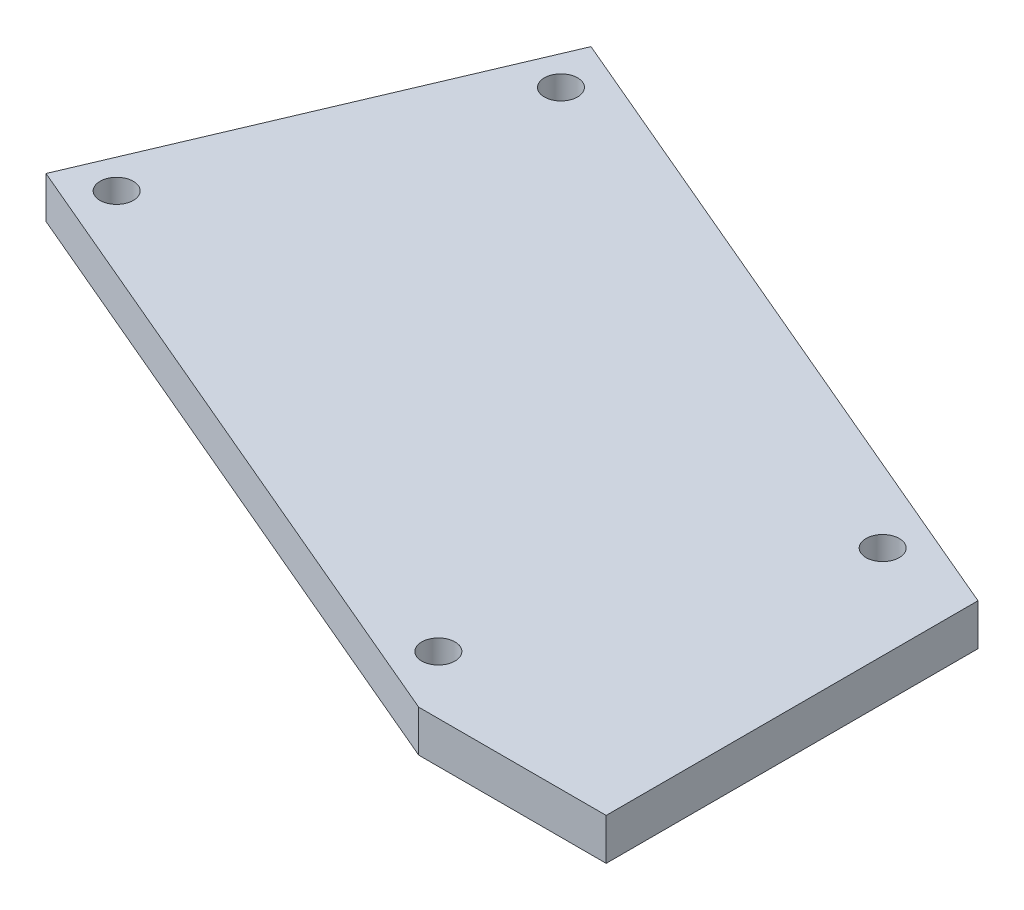
ISO-10303-21;
HEADER;
FILE_DESCRIPTION(('STEP AP214'),'2;1');
FILE_NAME('part.step','',(''),(''),'','','');
FILE_SCHEMA(('AUTOMOTIVE_DESIGN { 1 0 10303 214 1 1 1 1 }'));
ENDSEC;
DATA;
#1=APPLICATION_CONTEXT('core data for automotive mechanical design processes');
#2=APPLICATION_PROTOCOL_DEFINITION('international standard','automotive_design',2000,#1);
#3=PRODUCT_CONTEXT('',#1,'mechanical');
#4=PRODUCT('Part','Part','',(#3));
#5=PRODUCT_RELATED_PRODUCT_CATEGORY('part','',(#4));
#6=PRODUCT_DEFINITION_FORMATION('','',#4);
#7=PRODUCT_DEFINITION_CONTEXT('part definition',#1,'design');
#8=PRODUCT_DEFINITION('design','',#6,#7);
#9=PRODUCT_DEFINITION_SHAPE('','',#8);
#10=(LENGTH_UNIT() NAMED_UNIT(*) SI_UNIT(.MILLI.,.METRE.));
#11=(NAMED_UNIT(*) PLANE_ANGLE_UNIT() SI_UNIT($,.RADIAN.));
#12=(NAMED_UNIT(*) SI_UNIT($,.STERADIAN.) SOLID_ANGLE_UNIT());
#13=UNCERTAINTY_MEASURE_WITH_UNIT(LENGTH_MEASURE(1.E-05),#10,'distance_accuracy_value','');
#14=(GEOMETRIC_REPRESENTATION_CONTEXT(3) GLOBAL_UNCERTAINTY_ASSIGNED_CONTEXT((#13)) GLOBAL_UNIT_ASSIGNED_CONTEXT((#10,
#11,#12)) REPRESENTATION_CONTEXT('',''));
#15=CARTESIAN_POINT('',(0.,0.,0.));
#16=DIRECTION('',(0.,0.,1.));
#17=DIRECTION('',(1.,0.,0.));
#18=AXIS2_PLACEMENT_3D('',#15,#16,#17);
#19=CARTESIAN_POINT('',(0.,3.175,0.));
#20=DIRECTION('',(0.,-1.,0.));
#21=DIRECTION('',(0.,0.,-1.));
#22=AXIS2_PLACEMENT_3D('',#19,#20,#21);
#23=PLANE('',#22);
#24=CARTESIAN_POINT('',(-17.2577410529597,3.175,23.9745232491098));
#25=DIRECTION('',(0.,1.,0.));
#26=DIRECTION('',(0.,0.,1.));
#27=AXIS2_PLACEMENT_3D('',#24,#25,#26);
#28=CIRCLE('',#27,1.27);
#29=CARTESIAN_POINT('',(-17.2577410529597,3.175,25.2445232491098));
#30=VERTEX_POINT('',#29);
#31=EDGE_CURVE('E178',#30,#30,#28,.T.);
#32=ORIENTED_EDGE('',*,*,#31,.F.);
#33=EDGE_LOOP('',(#32));
#34=FACE_BOUND('',#33,.T.);
#35=CARTESIAN_POINT('',(-49.8993835743969,3.175,-18.0337554514725));
#36=DIRECTION('',(0.,1.,0.));
#37=DIRECTION('',(0.,0.,1.));
#38=AXIS2_PLACEMENT_3D('',#35,#36,#37);
#39=CIRCLE('',#38,1.27);
#40=CARTESIAN_POINT('',(-49.8993835743969,3.175,-16.7637554514725));
#41=VERTEX_POINT('',#40);
#42=EDGE_CURVE('E117',#41,#41,#39,.T.);
#43=ORIENTED_EDGE('',*,*,#42,.F.);
#44=EDGE_LOOP('',(#43));
#45=FACE_BOUND('',#44,.T.);
#46=DIRECTION('',(0.,0.,-1.));
#47=VECTOR('',#46,1.);
#48=CARTESIAN_POINT('',(0.,3.175,0.));
#49=LINE('',#48,#47);
#50=CARTESIAN_POINT('',(0.,3.175,28.4101902752035));
#51=VERTEX_POINT('',#50);
#52=CARTESIAN_POINT('',(0.,3.175,0.));
#53=VERTEX_POINT('',#52);
#54=EDGE_CURVE('E122',#51,#53,#49,.T.);
#55=ORIENTED_EDGE('',*,*,#54,.T.);
#56=DIRECTION('',(-0.920234570630628,0.,-0.391367263598098));
#57=VECTOR('',#56,1.);
#58=CARTESIAN_POINT('',(0.,3.175,0.));
#59=LINE('',#58,#57);
#60=CARTESIAN_POINT('',(-51.4509215930382,3.175,-21.8816017525493));
#61=VERTEX_POINT('',#60);
#62=EDGE_CURVE('E89',#53,#61,#59,.T.);
#63=ORIENTED_EDGE('',*,*,#62,.T.);
#64=DIRECTION('',(-0.391367263598097,0.,0.920234570630629));
#65=VECTOR('',#64,1.);
#66=CARTESIAN_POINT('',(-51.4509215930382,3.175,-21.8816017525493));
#67=LINE('',#66,#65);
#68=CARTESIAN_POINT('',(-63.8768322122778,3.175,7.33584586497312));
#69=VERTEX_POINT('',#68);
#70=EDGE_CURVE('E93',#61,#69,#67,.T.);
#71=ORIENTED_EDGE('',*,*,#70,.T.);
#72=DIRECTION('',(0.920234570630629,0.,0.391367263598097));
#73=VECTOR('',#72,1.);
#74=CARTESIAN_POINT('',(-63.8768322122778,3.175,7.33584586497312));
#75=LINE('',#74,#73);
#76=CARTESIAN_POINT('',(-14.3240410529597,3.175,28.4101902752035));
#77=VERTEX_POINT('',#76);
#78=EDGE_CURVE('E97',#69,#77,#75,.T.);
#79=ORIENTED_EDGE('',*,*,#78,.T.);
#80=DIRECTION('',(1.,0.,0.));
#81=VECTOR('',#80,1.);
#82=CARTESIAN_POINT('',(0.,3.175,28.4101902752035));
#83=LINE('',#82,#81);
#84=EDGE_CURVE('E55',#77,#51,#83,.T.);
#85=ORIENTED_EDGE('',*,*,#84,.T.);
#86=EDGE_LOOP('',(#55,#63,#71,#79,#85));
#87=FACE_BOUND('',#86,.T.);
#88=CARTESIAN_POINT('',(-60.028985911201,3.175,5.78430784633178));
#89=DIRECTION('',(0.,1.,0.));
#90=DIRECTION('',(0.,0.,1.));
#91=AXIS2_PLACEMENT_3D('',#88,#89,#90);
#92=CIRCLE('',#91,1.27);
#93=CARTESIAN_POINT('',(-60.028985911201,3.175,7.05430784633178));
#94=VERTEX_POINT('',#93);
#95=EDGE_CURVE('E184',#94,#94,#92,.T.);
#96=ORIENTED_EDGE('',*,*,#95,.F.);
#97=EDGE_LOOP('',(#96));
#98=FACE_BOUND('',#97,.T.);
#99=CARTESIAN_POINT('',(-7.12813871615561,3.175,0.156459951305494));
#100=DIRECTION('',(0.,1.,0.));
#101=DIRECTION('',(0.,0.,1.));
#102=AXIS2_PLACEMENT_3D('',#99,#100,#101);
#103=CIRCLE('',#102,1.27);
#104=CARTESIAN_POINT('',(-7.12813871615561,3.175,1.42645995130549));
#105=VERTEX_POINT('',#104);
#106=EDGE_CURVE('E169',#105,#105,#103,.T.);
#107=ORIENTED_EDGE('',*,*,#106,.F.);
#108=EDGE_LOOP('',(#107));
#109=FACE_BOUND('',#108,.T.);
#110=ADVANCED_FACE('F37',(#34,#45,#87,#98,#109),#23,.F.);
#111=CARTESIAN_POINT('',(0.,0.,0.));
#112=DIRECTION('',(0.,-1.,0.));
#113=DIRECTION('',(0.,0.,-1.));
#114=AXIS2_PLACEMENT_3D('',#111,#112,#113);
#115=PLANE('',#114);
#116=CARTESIAN_POINT('',(-17.2577410529597,0.,23.9745232491098));
#117=DIRECTION('',(0.,1.,0.));
#118=DIRECTION('',(0.,0.,1.));
#119=AXIS2_PLACEMENT_3D('',#116,#117,#118);
#120=CIRCLE('',#119,1.27);
#121=CARTESIAN_POINT('',(-17.2577410529597,0.,25.2445232491098));
#122=VERTEX_POINT('',#121);
#123=EDGE_CURVE('E175',#122,#122,#120,.T.);
#124=ORIENTED_EDGE('',*,*,#123,.T.);
#125=EDGE_LOOP('',(#124));
#126=FACE_BOUND('',#125,.T.);
#127=CARTESIAN_POINT('',(-49.8993835743969,0.,-18.0337554514725));
#128=DIRECTION('',(0.,1.,0.));
#129=DIRECTION('',(0.,0.,1.));
#130=AXIS2_PLACEMENT_3D('',#127,#128,#129);
#131=CIRCLE('',#130,1.27);
#132=CARTESIAN_POINT('',(-49.8993835743969,0.,-16.7637554514725));
#133=VERTEX_POINT('',#132);
#134=EDGE_CURVE('E187',#133,#133,#131,.T.);
#135=ORIENTED_EDGE('',*,*,#134,.T.);
#136=EDGE_LOOP('',(#135));
#137=FACE_BOUND('',#136,.T.);
#138=DIRECTION('',(0.,0.,-1.));
#139=VECTOR('',#138,1.);
#140=CARTESIAN_POINT('',(0.,0.,0.));
#141=LINE('',#140,#139);
#142=CARTESIAN_POINT('',(0.,0.,28.4101902752035));
#143=VERTEX_POINT('',#142);
#144=CARTESIAN_POINT('',(0.,0.,0.));
#145=VERTEX_POINT('',#144);
#146=EDGE_CURVE('E113',#143,#145,#141,.T.);
#147=ORIENTED_EDGE('',*,*,#146,.F.);
#148=DIRECTION('',(1.,0.,0.));
#149=VECTOR('',#148,1.);
#150=CARTESIAN_POINT('',(0.,0.,28.4101902752035));
#151=LINE('',#150,#149);
#152=CARTESIAN_POINT('',(-14.3240410529597,0.,28.4101902752035));
#153=VERTEX_POINT('',#152);
#154=EDGE_CURVE('E81',#153,#143,#151,.T.);
#155=ORIENTED_EDGE('',*,*,#154,.F.);
#156=DIRECTION('',(0.920234570630629,0.,0.391367263598097));
#157=VECTOR('',#156,1.);
#158=CARTESIAN_POINT('',(-63.8768322122778,0.,7.33584586497312));
#159=LINE('',#158,#157);
#160=CARTESIAN_POINT('',(-63.8768322122778,0.,7.33584586497312));
#161=VERTEX_POINT('',#160);
#162=EDGE_CURVE('E75',#161,#153,#159,.T.);
#163=ORIENTED_EDGE('',*,*,#162,.F.);
#164=DIRECTION('',(-0.391367263598097,0.,0.920234570630629));
#165=VECTOR('',#164,1.);
#166=CARTESIAN_POINT('',(-51.4509215930382,0.,-21.8816017525493));
#167=LINE('',#166,#165);
#168=CARTESIAN_POINT('',(-51.4509215930382,0.,-21.8816017525493));
#169=VERTEX_POINT('',#168);
#170=EDGE_CURVE('E104',#169,#161,#167,.T.);
#171=ORIENTED_EDGE('',*,*,#170,.F.);
#172=DIRECTION('',(-0.920234570630628,0.,-0.391367263598098));
#173=VECTOR('',#172,1.);
#174=CARTESIAN_POINT('',(0.,0.,0.));
#175=LINE('',#174,#173);
#176=EDGE_CURVE('E116',#145,#169,#175,.T.);
#177=ORIENTED_EDGE('',*,*,#176,.F.);
#178=EDGE_LOOP('',(#147,#155,#163,#171,#177));
#179=FACE_BOUND('',#178,.T.);
#180=CARTESIAN_POINT('',(-60.028985911201,0.,5.78430784633178));
#181=DIRECTION('',(0.,1.,0.));
#182=DIRECTION('',(0.,0.,1.));
#183=AXIS2_PLACEMENT_3D('',#180,#181,#182);
#184=CIRCLE('',#183,1.27);
#185=CARTESIAN_POINT('',(-60.028985911201,0.,7.05430784633178));
#186=VERTEX_POINT('',#185);
#187=EDGE_CURVE('E181',#186,#186,#184,.T.);
#188=ORIENTED_EDGE('',*,*,#187,.T.);
#189=EDGE_LOOP('',(#188));
#190=FACE_BOUND('',#189,.T.);
#191=CARTESIAN_POINT('',(-7.12813871615561,0.,0.156459951305494));
#192=DIRECTION('',(0.,1.,0.));
#193=DIRECTION('',(0.,0.,1.));
#194=AXIS2_PLACEMENT_3D('',#191,#192,#193);
#195=CIRCLE('',#194,1.27);
#196=CARTESIAN_POINT('',(-7.12813871615561,0.,1.42645995130549));
#197=VERTEX_POINT('',#196);
#198=EDGE_CURVE('E172',#197,#197,#195,.T.);
#199=ORIENTED_EDGE('',*,*,#198,.T.);
#200=EDGE_LOOP('',(#199));
#201=FACE_BOUND('',#200,.T.);
#202=ADVANCED_FACE('F126',(#126,#137,#179,#190,#201),#115,.T.);
#203=CARTESIAN_POINT('',(0.,3.175,0.));
#204=DIRECTION('',(-1.,0.,0.));
#205=DIRECTION('',(0.,0.,1.));
#206=AXIS2_PLACEMENT_3D('',#203,#204,#205);
#207=PLANE('',#206);
#208=ORIENTED_EDGE('',*,*,#146,.T.);
#209=DIRECTION('',(0.,-1.,0.));
#210=VECTOR('',#209,1.);
#211=CARTESIAN_POINT('',(0.,3.175,0.));
#212=LINE('',#211,#210);
#213=EDGE_CURVE('E11',#53,#145,#212,.T.);
#214=ORIENTED_EDGE('',*,*,#213,.F.);
#215=ORIENTED_EDGE('',*,*,#54,.F.);
#216=DIRECTION('',(0.,-1.,0.));
#217=VECTOR('',#216,1.);
#218=CARTESIAN_POINT('',(0.,3.175,28.4101902752035));
#219=LINE('',#218,#217);
#220=EDGE_CURVE('E109',#51,#143,#219,.T.);
#221=ORIENTED_EDGE('',*,*,#220,.T.);
#222=EDGE_LOOP('',(#208,#214,#215,#221));
#223=FACE_BOUND('',#222,.T.);
#224=ADVANCED_FACE('F39',(#223),#207,.F.);
#225=CARTESIAN_POINT('',(0.,3.175,0.));
#226=DIRECTION('',(-0.391367263598098,0.,0.920234570630628));
#227=DIRECTION('',(0.920234570630628,0.,0.391367263598098));
#228=AXIS2_PLACEMENT_3D('',#225,#226,#227);
#229=PLANE('',#228);
#230=ORIENTED_EDGE('',*,*,#176,.T.);
#231=DIRECTION('',(0.,-1.,0.));
#232=VECTOR('',#231,1.);
#233=CARTESIAN_POINT('',(-51.4509215930382,3.175,-21.8816017525493));
#234=LINE('',#233,#232);
#235=EDGE_CURVE('E47',#61,#169,#234,.T.);
#236=ORIENTED_EDGE('',*,*,#235,.F.);
#237=ORIENTED_EDGE('',*,*,#62,.F.);
#238=ORIENTED_EDGE('',*,*,#213,.T.);
#239=EDGE_LOOP('',(#230,#236,#237,#238));
#240=FACE_BOUND('',#239,.T.);
#241=ADVANCED_FACE('F235',(#240),#229,.F.);
#242=CARTESIAN_POINT('',(-51.4509215930382,3.175,-21.8816017525493));
#243=DIRECTION('',(0.920234570630629,0.,0.391367263598097));
#244=DIRECTION('',(0.391367263598097,0.,-0.920234570630629));
#245=AXIS2_PLACEMENT_3D('',#242,#243,#244);
#246=PLANE('',#245);
#247=ORIENTED_EDGE('',*,*,#170,.T.);
#248=DIRECTION('',(0.,-1.,0.));
#249=VECTOR('',#248,1.);
#250=CARTESIAN_POINT('',(-63.8768322122778,3.175,7.33584586497312));
#251=LINE('',#250,#249);
#252=EDGE_CURVE('E101',#69,#161,#251,.T.);
#253=ORIENTED_EDGE('',*,*,#252,.F.);
#254=ORIENTED_EDGE('',*,*,#70,.F.);
#255=ORIENTED_EDGE('',*,*,#235,.T.);
#256=EDGE_LOOP('',(#247,#253,#254,#255));
#257=FACE_BOUND('',#256,.T.);
#258=ADVANCED_FACE('F102',(#257),#246,.F.);
#259=CARTESIAN_POINT('',(-63.8768322122778,3.175,7.33584586497312));
#260=DIRECTION('',(0.391367263598097,0.,-0.920234570630629));
#261=DIRECTION('',(-0.920234570630629,0.,-0.391367263598097));
#262=AXIS2_PLACEMENT_3D('',#259,#260,#261);
#263=PLANE('',#262);
#264=ORIENTED_EDGE('',*,*,#162,.T.);
#265=DIRECTION('',(0.,-1.,0.));
#266=VECTOR('',#265,1.);
#267=CARTESIAN_POINT('',(-14.3240410529597,3.175,28.4101902752035));
#268=LINE('',#267,#266);
#269=EDGE_CURVE('E105',#77,#153,#268,.T.);
#270=ORIENTED_EDGE('',*,*,#269,.F.);
#271=ORIENTED_EDGE('',*,*,#78,.F.);
#272=ORIENTED_EDGE('',*,*,#252,.T.);
#273=EDGE_LOOP('',(#264,#270,#271,#272));
#274=FACE_BOUND('',#273,.T.);
#275=ADVANCED_FACE('F107',(#274),#263,.F.);
#276=CARTESIAN_POINT('',(0.,3.175,28.4101902752035));
#277=DIRECTION('',(0.,0.,-1.));
#278=DIRECTION('',(-1.,0.,0.));
#279=AXIS2_PLACEMENT_3D('',#276,#277,#278);
#280=PLANE('',#279);
#281=ORIENTED_EDGE('',*,*,#154,.T.);
#282=ORIENTED_EDGE('',*,*,#220,.F.);
#283=ORIENTED_EDGE('',*,*,#84,.F.);
#284=ORIENTED_EDGE('',*,*,#269,.T.);
#285=EDGE_LOOP('',(#281,#282,#283,#284));
#286=FACE_BOUND('',#285,.T.);
#287=ADVANCED_FACE('F131',(#286),#280,.F.);
#288=CARTESIAN_POINT('',(-49.8993835743969,3.175,-18.0337554514725));
#289=DIRECTION('',(0.,-1.,0.));
#290=DIRECTION('',(0.,0.,-1.));
#291=AXIS2_PLACEMENT_3D('',#288,#289,#290);
#292=CYLINDRICAL_SURFACE('',#291,1.27);
#293=ORIENTED_EDGE('',*,*,#42,.T.);
#294=EDGE_LOOP('',(#293));
#295=FACE_BOUND('',#294,.T.);
#296=ORIENTED_EDGE('',*,*,#134,.F.);
#297=EDGE_LOOP('',(#296));
#298=FACE_BOUND('',#297,.T.);
#299=ADVANCED_FACE('F133',(#295,#298),#292,.F.);
#300=CARTESIAN_POINT('',(-60.028985911201,3.175,5.78430784633178));
#301=DIRECTION('',(0.,-1.,0.));
#302=DIRECTION('',(0.,0.,-1.));
#303=AXIS2_PLACEMENT_3D('',#300,#301,#302);
#304=CYLINDRICAL_SURFACE('',#303,1.27);
#305=ORIENTED_EDGE('',*,*,#95,.T.);
#306=EDGE_LOOP('',(#305));
#307=FACE_BOUND('',#306,.T.);
#308=ORIENTED_EDGE('',*,*,#187,.F.);
#309=EDGE_LOOP('',(#308));
#310=FACE_BOUND('',#309,.T.);
#311=ADVANCED_FACE('F139',(#307,#310),#304,.F.);
#312=CARTESIAN_POINT('',(-17.2577410529597,3.175,23.9745232491098));
#313=DIRECTION('',(0.,-1.,0.));
#314=DIRECTION('',(0.,0.,-1.));
#315=AXIS2_PLACEMENT_3D('',#312,#313,#314);
#316=CYLINDRICAL_SURFACE('',#315,1.27);
#317=ORIENTED_EDGE('',*,*,#31,.T.);
#318=EDGE_LOOP('',(#317));
#319=FACE_BOUND('',#318,.T.);
#320=ORIENTED_EDGE('',*,*,#123,.F.);
#321=EDGE_LOOP('',(#320));
#322=FACE_BOUND('',#321,.T.);
#323=ADVANCED_FACE('F156',(#319,#322),#316,.F.);
#324=CARTESIAN_POINT('',(-7.12813871615561,3.175,0.156459951305494));
#325=DIRECTION('',(0.,-1.,0.));
#326=DIRECTION('',(0.,0.,-1.));
#327=AXIS2_PLACEMENT_3D('',#324,#325,#326);
#328=CYLINDRICAL_SURFACE('',#327,1.27);
#329=ORIENTED_EDGE('',*,*,#106,.T.);
#330=EDGE_LOOP('',(#329));
#331=FACE_BOUND('',#330,.T.);
#332=ORIENTED_EDGE('',*,*,#198,.F.);
#333=EDGE_LOOP('',(#332));
#334=FACE_BOUND('',#333,.T.);
#335=ADVANCED_FACE('F160',(#331,#334),#328,.F.);
#336=CLOSED_SHELL('',(#110,#202,#224,#241,#258,#275,#287,#299,#311,#323,#335));
#337=MANIFOLD_SOLID_BREP('B2',#336);
#338=ADVANCED_BREP_SHAPE_REPRESENTATION('',(#18,#337),#14);
#339=SHAPE_DEFINITION_REPRESENTATION(#9,#338);
ENDSEC;
END-ISO-10303-21;
